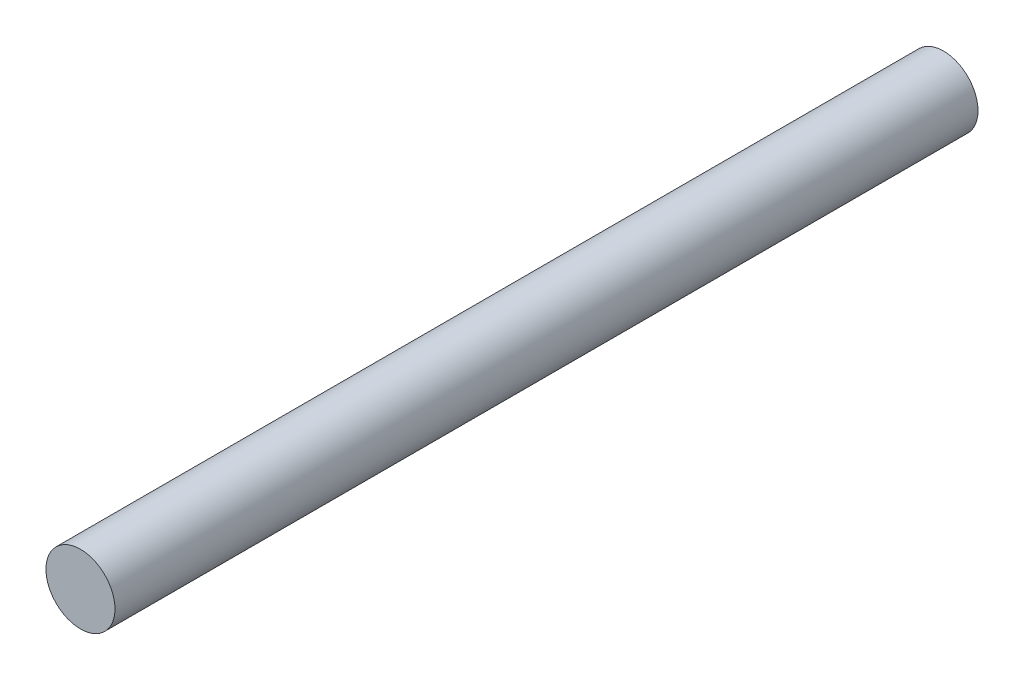
ISO-10303-21;
HEADER;
FILE_DESCRIPTION(('STEP AP214'),'2;1');
FILE_NAME('part.step','',(''),(''),'','','');
FILE_SCHEMA(('AUTOMOTIVE_DESIGN { 1 0 10303 214 1 1 1 1 }'));
ENDSEC;
DATA;
#1=APPLICATION_CONTEXT('core data for automotive mechanical design processes');
#2=APPLICATION_PROTOCOL_DEFINITION('international standard','automotive_design',2000,#1);
#3=PRODUCT_CONTEXT('',#1,'mechanical');
#4=PRODUCT('Part','Part','',(#3));
#5=PRODUCT_RELATED_PRODUCT_CATEGORY('part','',(#4));
#6=PRODUCT_DEFINITION_FORMATION('','',#4);
#7=PRODUCT_DEFINITION_CONTEXT('part definition',#1,'design');
#8=PRODUCT_DEFINITION('design','',#6,#7);
#9=PRODUCT_DEFINITION_SHAPE('','',#8);
#10=(LENGTH_UNIT() NAMED_UNIT(*) SI_UNIT(.MILLI.,.METRE.));
#11=(NAMED_UNIT(*) PLANE_ANGLE_UNIT() SI_UNIT($,.RADIAN.));
#12=(NAMED_UNIT(*) SI_UNIT($,.STERADIAN.) SOLID_ANGLE_UNIT());
#13=UNCERTAINTY_MEASURE_WITH_UNIT(LENGTH_MEASURE(1.E-05),#10,'distance_accuracy_value','');
#14=(GEOMETRIC_REPRESENTATION_CONTEXT(3) GLOBAL_UNCERTAINTY_ASSIGNED_CONTEXT((#13)) GLOBAL_UNIT_ASSIGNED_CONTEXT((#10,
#11,#12)) REPRESENTATION_CONTEXT('',''));
#15=CARTESIAN_POINT('',(0.,0.,0.));
#16=DIRECTION('',(0.,0.,1.));
#17=DIRECTION('',(1.,0.,0.));
#18=AXIS2_PLACEMENT_3D('',#15,#16,#17);
#19=CARTESIAN_POINT('',(0.,0.,150.));
#20=DIRECTION('',(0.,0.,-1.));
#21=DIRECTION('',(-1.,0.,0.));
#22=AXIS2_PLACEMENT_3D('',#19,#20,#21);
#23=CYLINDRICAL_SURFACE('',#22,6.);
#24=CARTESIAN_POINT('',(0.,0.,150.));
#25=DIRECTION('',(0.,0.,1.));
#26=DIRECTION('',(1.,0.,0.));
#27=AXIS2_PLACEMENT_3D('',#24,#25,#26);
#28=CIRCLE('',#27,6.);
#29=CARTESIAN_POINT('',(6.,0.,150.));
#30=VERTEX_POINT('',#29);
#31=EDGE_CURVE('E10',#30,#30,#28,.T.);
#32=ORIENTED_EDGE('',*,*,#31,.F.);
#33=EDGE_LOOP('',(#32));
#34=FACE_BOUND('',#33,.T.);
#35=CARTESIAN_POINT('',(0.,0.,0.));
#36=DIRECTION('',(0.,0.,1.));
#37=DIRECTION('',(1.,0.,0.));
#38=AXIS2_PLACEMENT_3D('',#35,#36,#37);
#39=CIRCLE('',#38,6.);
#40=CARTESIAN_POINT('',(6.,0.,0.));
#41=VERTEX_POINT('',#40);
#42=EDGE_CURVE('E36',#41,#41,#39,.T.);
#43=ORIENTED_EDGE('',*,*,#42,.T.);
#44=EDGE_LOOP('',(#43));
#45=FACE_BOUND('',#44,.T.);
#46=ADVANCED_FACE('F33',(#34,#45),#23,.T.);
#47=CARTESIAN_POINT('',(0.,0.,150.));
#48=DIRECTION('',(0.,0.,1.));
#49=DIRECTION('',(1.,0.,0.));
#50=AXIS2_PLACEMENT_3D('',#47,#48,#49);
#51=PLANE('',#50);
#52=ORIENTED_EDGE('',*,*,#31,.T.);
#53=EDGE_LOOP('',(#52));
#54=FACE_BOUND('',#53,.T.);
#55=ADVANCED_FACE('F53',(#54),#51,.T.);
#56=CARTESIAN_POINT('',(0.,0.,0.));
#57=DIRECTION('',(0.,0.,1.));
#58=DIRECTION('',(1.,0.,0.));
#59=AXIS2_PLACEMENT_3D('',#56,#57,#58);
#60=PLANE('',#59);
#61=ORIENTED_EDGE('',*,*,#42,.F.);
#62=EDGE_LOOP('',(#61));
#63=FACE_BOUND('',#62,.T.);
#64=ADVANCED_FACE('F51',(#63),#60,.F.);
#65=CLOSED_SHELL('',(#46,#55,#64));
#66=MANIFOLD_SOLID_BREP('B2',#65);
#67=ADVANCED_BREP_SHAPE_REPRESENTATION('',(#18,#66),#14);
#68=SHAPE_DEFINITION_REPRESENTATION(#9,#67);
ENDSEC;
END-ISO-10303-21;
